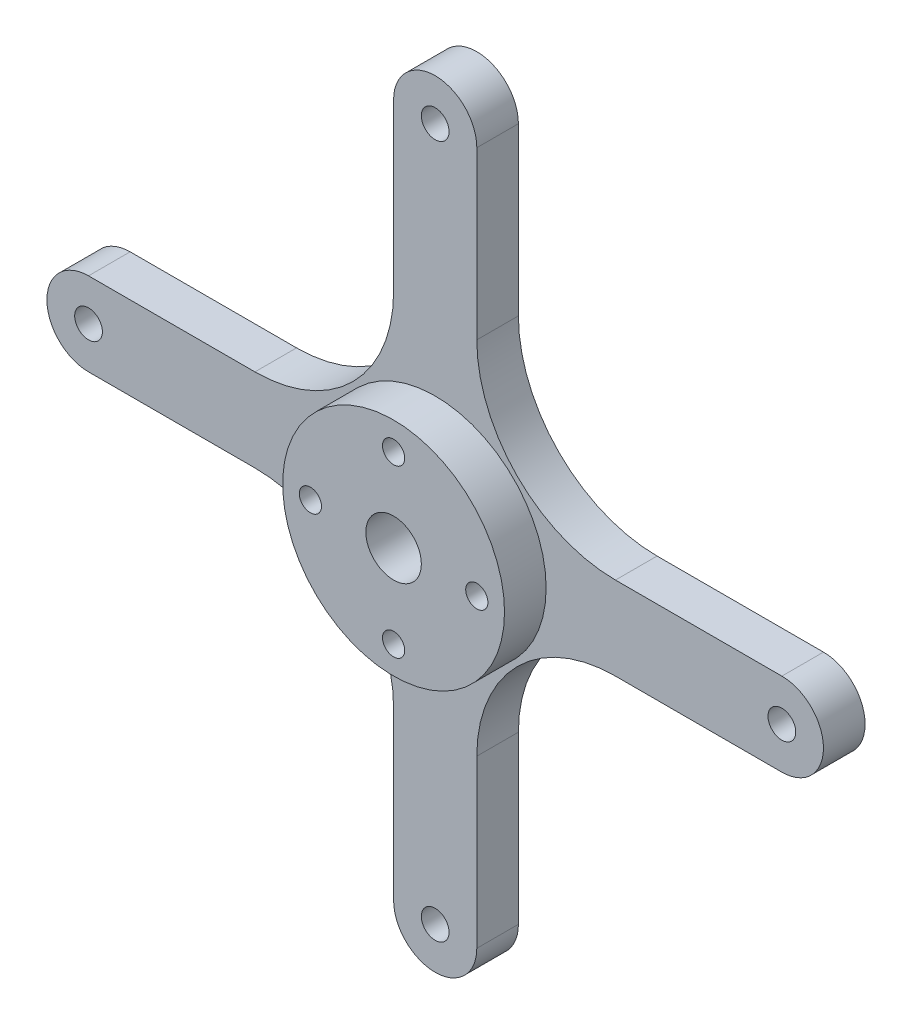
ISO-10303-21;
HEADER;
FILE_DESCRIPTION(('STEP AP214'),'2;1');
FILE_NAME('part.step','',(''),(''),'','','');
FILE_SCHEMA(('AUTOMOTIVE_DESIGN { 1 0 10303 214 1 1 1 1 }'));
ENDSEC;
DATA;
#1=APPLICATION_CONTEXT('core data for automotive mechanical design processes');
#2=APPLICATION_PROTOCOL_DEFINITION('international standard','automotive_design',2000,#1);
#3=PRODUCT_CONTEXT('',#1,'mechanical');
#4=PRODUCT('Part','Part','',(#3));
#5=PRODUCT_RELATED_PRODUCT_CATEGORY('part','',(#4));
#6=PRODUCT_DEFINITION_FORMATION('','',#4);
#7=PRODUCT_DEFINITION_CONTEXT('part definition',#1,'design');
#8=PRODUCT_DEFINITION('design','',#6,#7);
#9=PRODUCT_DEFINITION_SHAPE('','',#8);
#10=(LENGTH_UNIT() NAMED_UNIT(*) SI_UNIT(.MILLI.,.METRE.));
#11=(NAMED_UNIT(*) PLANE_ANGLE_UNIT() SI_UNIT($,.RADIAN.));
#12=(NAMED_UNIT(*) SI_UNIT($,.STERADIAN.) SOLID_ANGLE_UNIT());
#13=UNCERTAINTY_MEASURE_WITH_UNIT(LENGTH_MEASURE(1.E-05),#10,'distance_accuracy_value','');
#14=(GEOMETRIC_REPRESENTATION_CONTEXT(3) GLOBAL_UNCERTAINTY_ASSIGNED_CONTEXT((#13)) GLOBAL_UNIT_ASSIGNED_CONTEXT((#10,
#11,#12)) REPRESENTATION_CONTEXT('',''));
#15=CARTESIAN_POINT('',(0.,0.,0.));
#16=DIRECTION('',(0.,0.,1.));
#17=DIRECTION('',(1.,0.,0.));
#18=AXIS2_PLACEMENT_3D('',#15,#16,#17);
#19=CARTESIAN_POINT('',(0.,3.,3.));
#20=DIRECTION('',(0.,-1.,0.));
#21=DIRECTION('',(1.,0.,0.));
#22=AXIS2_PLACEMENT_3D('',#19,#20,#21);
#23=PLANE('',#22);
#24=DIRECTION('',(-1.,0.,0.));
#25=VECTOR('',#24,1.);
#26=CARTESIAN_POINT('',(0.,3.,0.));
#27=LINE('',#26,#25);
#28=CARTESIAN_POINT('',(25.,3.00000000000001,0.));
#29=VERTEX_POINT('',#28);
#30=CARTESIAN_POINT('',(13.,3.00000000000001,0.));
#31=VERTEX_POINT('',#30);
#32=EDGE_CURVE('E226',#29,#31,#27,.T.);
#33=ORIENTED_EDGE('',*,*,#32,.T.);
#34=DIRECTION('',(0.,0.,-1.));
#35=VECTOR('',#34,1.);
#36=CARTESIAN_POINT('',(13.,3.00000000000001,3.));
#37=LINE('',#36,#35);
#38=CARTESIAN_POINT('',(13.,3.00000000000001,3.));
#39=VERTEX_POINT('',#38);
#40=EDGE_CURVE('E63',#31,#39,#37,.F.);
#41=ORIENTED_EDGE('',*,*,#40,.T.);
#42=DIRECTION('',(-1.,0.,0.));
#43=VECTOR('',#42,1.);
#44=CARTESIAN_POINT('',(0.,3.,3.));
#45=LINE('',#44,#43);
#46=CARTESIAN_POINT('',(25.,3.00000000000001,3.));
#47=VERTEX_POINT('',#46);
#48=EDGE_CURVE('E175',#47,#39,#45,.T.);
#49=ORIENTED_EDGE('',*,*,#48,.F.);
#50=DIRECTION('',(0.,0.,-1.));
#51=VECTOR('',#50,1.);
#52=CARTESIAN_POINT('',(25.,3.00000000000001,3.));
#53=LINE('',#52,#51);
#54=EDGE_CURVE('E225',#47,#29,#53,.T.);
#55=ORIENTED_EDGE('',*,*,#54,.T.);
#56=EDGE_LOOP('',(#33,#41,#49,#55));
#57=FACE_BOUND('',#56,.T.);
#58=ADVANCED_FACE('F46',(#57),#23,.F.);
#59=CARTESIAN_POINT('',(2.99999999999999,0.,3.));
#60=DIRECTION('',(-1.,0.,0.));
#61=DIRECTION('',(0.,-1.,0.));
#62=AXIS2_PLACEMENT_3D('',#59,#60,#61);
#63=PLANE('',#62);
#64=DIRECTION('',(0.,1.,0.));
#65=VECTOR('',#64,1.);
#66=CARTESIAN_POINT('',(2.99999999999999,0.,3.));
#67=LINE('',#66,#65);
#68=CARTESIAN_POINT('',(2.99999999999999,13.,3.));
#69=VERTEX_POINT('',#68);
#70=CARTESIAN_POINT('',(2.99999999999999,25.,3.));
#71=VERTEX_POINT('',#70);
#72=EDGE_CURVE('E163',#69,#71,#67,.T.);
#73=ORIENTED_EDGE('',*,*,#72,.F.);
#74=DIRECTION('',(0.,0.,-1.));
#75=VECTOR('',#74,1.);
#76=CARTESIAN_POINT('',(2.99999999999999,13.,0.));
#77=LINE('',#76,#75);
#78=CARTESIAN_POINT('',(2.99999999999999,13.,0.));
#79=VERTEX_POINT('',#78);
#80=EDGE_CURVE('E325',#69,#79,#77,.T.);
#81=ORIENTED_EDGE('',*,*,#80,.T.);
#82=DIRECTION('',(0.,1.,0.));
#83=VECTOR('',#82,1.);
#84=CARTESIAN_POINT('',(2.99999999999999,0.,0.));
#85=LINE('',#84,#83);
#86=CARTESIAN_POINT('',(2.99999999999999,25.,0.));
#87=VERTEX_POINT('',#86);
#88=EDGE_CURVE('E180',#79,#87,#85,.T.);
#89=ORIENTED_EDGE('',*,*,#88,.T.);
#90=DIRECTION('',(0.,0.,-1.));
#91=VECTOR('',#90,1.);
#92=CARTESIAN_POINT('',(2.99999999999999,25.,3.));
#93=LINE('',#92,#91);
#94=EDGE_CURVE('E178',#71,#87,#93,.T.);
#95=ORIENTED_EDGE('',*,*,#94,.F.);
#96=EDGE_LOOP('',(#73,#81,#89,#95));
#97=FACE_BOUND('',#96,.T.);
#98=ADVANCED_FACE('F179',(#97),#63,.F.);
#99=CARTESIAN_POINT('',(0.,25.,3.));
#100=DIRECTION('',(0.,0.,-1.));
#101=DIRECTION('',(-1.,0.,0.));
#102=AXIS2_PLACEMENT_3D('',#99,#100,#101);
#103=CYLINDRICAL_SURFACE('',#102,3.);
#104=CARTESIAN_POINT('',(0.,25.,0.));
#105=DIRECTION('',(0.,0.,1.));
#106=DIRECTION('',(1.,0.,0.));
#107=AXIS2_PLACEMENT_3D('',#104,#105,#106);
#108=CIRCLE('',#107,3.);
#109=CARTESIAN_POINT('',(-3.00000000000001,25.,0.));
#110=VERTEX_POINT('',#109);
#111=EDGE_CURVE('E232',#87,#110,#108,.T.);
#112=ORIENTED_EDGE('',*,*,#111,.T.);
#113=DIRECTION('',(0.,0.,-1.));
#114=VECTOR('',#113,1.);
#115=CARTESIAN_POINT('',(-3.00000000000001,25.,3.));
#116=LINE('',#115,#114);
#117=CARTESIAN_POINT('',(-3.00000000000001,25.,3.));
#118=VERTEX_POINT('',#117);
#119=EDGE_CURVE('E186',#118,#110,#116,.T.);
#120=ORIENTED_EDGE('',*,*,#119,.F.);
#121=CARTESIAN_POINT('',(0.,25.,3.));
#122=DIRECTION('',(0.,0.,1.));
#123=DIRECTION('',(1.,0.,0.));
#124=AXIS2_PLACEMENT_3D('',#121,#122,#123);
#125=CIRCLE('',#124,3.);
#126=EDGE_CURVE('E168',#71,#118,#125,.T.);
#127=ORIENTED_EDGE('',*,*,#126,.F.);
#128=ORIENTED_EDGE('',*,*,#94,.T.);
#129=EDGE_LOOP('',(#112,#120,#127,#128));
#130=FACE_BOUND('',#129,.T.);
#131=ADVANCED_FACE('F188',(#130),#103,.T.);
#132=CARTESIAN_POINT('',(-3.00000000000001,0.,3.));
#133=DIRECTION('',(-1.,0.,0.));
#134=DIRECTION('',(0.,-1.,0.));
#135=AXIS2_PLACEMENT_3D('',#132,#133,#134);
#136=PLANE('',#135);
#137=DIRECTION('',(0.,1.,0.));
#138=VECTOR('',#137,1.);
#139=CARTESIAN_POINT('',(-3.00000000000001,0.,0.));
#140=LINE('',#139,#138);
#141=CARTESIAN_POINT('',(-3.00000000000001,13.,0.));
#142=VERTEX_POINT('',#141);
#143=EDGE_CURVE('E235',#142,#110,#140,.T.);
#144=ORIENTED_EDGE('',*,*,#143,.F.);
#145=DIRECTION('',(0.,0.,-1.));
#146=VECTOR('',#145,1.);
#147=CARTESIAN_POINT('',(-3.00000000000001,13.,3.));
#148=LINE('',#147,#146);
#149=CARTESIAN_POINT('',(-3.00000000000001,13.,3.));
#150=VERTEX_POINT('',#149);
#151=EDGE_CURVE('E308',#142,#150,#148,.F.);
#152=ORIENTED_EDGE('',*,*,#151,.T.);
#153=DIRECTION('',(0.,1.,0.));
#154=VECTOR('',#153,1.);
#155=CARTESIAN_POINT('',(-3.00000000000001,0.,3.));
#156=LINE('',#155,#154);
#157=EDGE_CURVE('E191',#150,#118,#156,.T.);
#158=ORIENTED_EDGE('',*,*,#157,.T.);
#159=ORIENTED_EDGE('',*,*,#119,.T.);
#160=EDGE_LOOP('',(#144,#152,#158,#159));
#161=FACE_BOUND('',#160,.T.);
#162=ADVANCED_FACE('F401',(#161),#136,.T.);
#163=CARTESIAN_POINT('',(0.,3.,3.));
#164=DIRECTION('',(0.,-1.,0.));
#165=DIRECTION('',(1.,0.,0.));
#166=AXIS2_PLACEMENT_3D('',#163,#164,#165);
#167=PLANE('',#166);
#168=DIRECTION('',(-1.,0.,0.));
#169=VECTOR('',#168,1.);
#170=CARTESIAN_POINT('',(0.,3.,3.));
#171=LINE('',#170,#169);
#172=CARTESIAN_POINT('',(-13.,3.,3.));
#173=VERTEX_POINT('',#172);
#174=CARTESIAN_POINT('',(-25.,3.,3.));
#175=VERTEX_POINT('',#174);
#176=EDGE_CURVE('E194',#173,#175,#171,.T.);
#177=ORIENTED_EDGE('',*,*,#176,.F.);
#178=DIRECTION('',(0.,0.,-1.));
#179=VECTOR('',#178,1.);
#180=CARTESIAN_POINT('',(-13.,3.,3.));
#181=LINE('',#180,#179);
#182=CARTESIAN_POINT('',(-13.,3.,0.));
#183=VERTEX_POINT('',#182);
#184=EDGE_CURVE('E185',#173,#183,#181,.T.);
#185=ORIENTED_EDGE('',*,*,#184,.T.);
#186=DIRECTION('',(-1.,0.,0.));
#187=VECTOR('',#186,1.);
#188=CARTESIAN_POINT('',(0.,3.,0.));
#189=LINE('',#188,#187);
#190=CARTESIAN_POINT('',(-25.,3.,0.));
#191=VERTEX_POINT('',#190);
#192=EDGE_CURVE('E238',#183,#191,#189,.T.);
#193=ORIENTED_EDGE('',*,*,#192,.T.);
#194=DIRECTION('',(0.,0.,-1.));
#195=VECTOR('',#194,1.);
#196=CARTESIAN_POINT('',(-25.,3.,3.));
#197=LINE('',#196,#195);
#198=EDGE_CURVE('E299',#175,#191,#197,.T.);
#199=ORIENTED_EDGE('',*,*,#198,.F.);
#200=EDGE_LOOP('',(#177,#185,#193,#199));
#201=FACE_BOUND('',#200,.T.);
#202=ADVANCED_FACE('F394',(#201),#167,.F.);
#203=CARTESIAN_POINT('',(-25.,0.,3.));
#204=DIRECTION('',(0.,0.,-1.));
#205=DIRECTION('',(-1.,0.,0.));
#206=AXIS2_PLACEMENT_3D('',#203,#204,#205);
#207=CYLINDRICAL_SURFACE('',#206,3.);
#208=CARTESIAN_POINT('',(-25.,0.,0.));
#209=DIRECTION('',(0.,0.,1.));
#210=DIRECTION('',(1.,0.,0.));
#211=AXIS2_PLACEMENT_3D('',#208,#209,#210);
#212=CIRCLE('',#211,3.);
#213=CARTESIAN_POINT('',(-25.,-3.,0.));
#214=VERTEX_POINT('',#213);
#215=EDGE_CURVE('E241',#191,#214,#212,.T.);
#216=ORIENTED_EDGE('',*,*,#215,.T.);
#217=DIRECTION('',(0.,0.,-1.));
#218=VECTOR('',#217,1.);
#219=CARTESIAN_POINT('',(-25.,-3.,3.));
#220=LINE('',#219,#218);
#221=CARTESIAN_POINT('',(-25.,-3.,3.));
#222=VERTEX_POINT('',#221);
#223=EDGE_CURVE('E295',#222,#214,#220,.T.);
#224=ORIENTED_EDGE('',*,*,#223,.F.);
#225=CARTESIAN_POINT('',(-25.,0.,3.));
#226=DIRECTION('',(0.,0.,1.));
#227=DIRECTION('',(1.,0.,0.));
#228=AXIS2_PLACEMENT_3D('',#225,#226,#227);
#229=CIRCLE('',#228,3.);
#230=EDGE_CURVE('E200',#175,#222,#229,.T.);
#231=ORIENTED_EDGE('',*,*,#230,.F.);
#232=ORIENTED_EDGE('',*,*,#198,.T.);
#233=EDGE_LOOP('',(#216,#224,#231,#232));
#234=FACE_BOUND('',#233,.T.);
#235=ADVANCED_FACE('F388',(#234),#207,.T.);
#236=CARTESIAN_POINT('',(0.,-3.,3.));
#237=DIRECTION('',(0.,-1.,0.));
#238=DIRECTION('',(1.,0.,0.));
#239=AXIS2_PLACEMENT_3D('',#236,#237,#238);
#240=PLANE('',#239);
#241=DIRECTION('',(-1.,0.,0.));
#242=VECTOR('',#241,1.);
#243=CARTESIAN_POINT('',(0.,-3.,0.));
#244=LINE('',#243,#242);
#245=CARTESIAN_POINT('',(-13.,-3.,0.));
#246=VERTEX_POINT('',#245);
#247=EDGE_CURVE('E245',#246,#214,#244,.T.);
#248=ORIENTED_EDGE('',*,*,#247,.F.);
#249=DIRECTION('',(0.,0.,-1.));
#250=VECTOR('',#249,1.);
#251=CARTESIAN_POINT('',(-13.,-3.,3.));
#252=LINE('',#251,#250);
#253=CARTESIAN_POINT('',(-13.,-3.,3.));
#254=VERTEX_POINT('',#253);
#255=EDGE_CURVE('E315',#246,#254,#252,.F.);
#256=ORIENTED_EDGE('',*,*,#255,.T.);
#257=DIRECTION('',(-1.,0.,0.));
#258=VECTOR('',#257,1.);
#259=CARTESIAN_POINT('',(0.,-3.,3.));
#260=LINE('',#259,#258);
#261=EDGE_CURVE('E204',#254,#222,#260,.T.);
#262=ORIENTED_EDGE('',*,*,#261,.T.);
#263=ORIENTED_EDGE('',*,*,#223,.T.);
#264=EDGE_LOOP('',(#248,#256,#262,#263));
#265=FACE_BOUND('',#264,.T.);
#266=ADVANCED_FACE('F383',(#265),#240,.T.);
#267=CARTESIAN_POINT('',(-3.00000000000001,0.,3.));
#268=DIRECTION('',(-1.,0.,0.));
#269=DIRECTION('',(0.,-1.,0.));
#270=AXIS2_PLACEMENT_3D('',#267,#268,#269);
#271=PLANE('',#270);
#272=DIRECTION('',(0.,1.,0.));
#273=VECTOR('',#272,1.);
#274=CARTESIAN_POINT('',(-3.00000000000001,0.,3.));
#275=LINE('',#274,#273);
#276=CARTESIAN_POINT('',(-3.00000000000001,-25.,3.));
#277=VERTEX_POINT('',#276);
#278=CARTESIAN_POINT('',(-3.00000000000001,-13.,3.));
#279=VERTEX_POINT('',#278);
#280=EDGE_CURVE('E207',#277,#279,#275,.T.);
#281=ORIENTED_EDGE('',*,*,#280,.T.);
#282=DIRECTION('',(0.,0.,-1.));
#283=VECTOR('',#282,1.);
#284=CARTESIAN_POINT('',(-3.00000000000001,-13.,0.));
#285=LINE('',#284,#283);
#286=CARTESIAN_POINT('',(-3.00000000000001,-13.,0.));
#287=VERTEX_POINT('',#286);
#288=EDGE_CURVE('E311',#279,#287,#285,.T.);
#289=ORIENTED_EDGE('',*,*,#288,.T.);
#290=DIRECTION('',(0.,1.,0.));
#291=VECTOR('',#290,1.);
#292=CARTESIAN_POINT('',(-3.00000000000001,0.,0.));
#293=LINE('',#292,#291);
#294=CARTESIAN_POINT('',(-3.00000000000001,-25.,0.));
#295=VERTEX_POINT('',#294);
#296=EDGE_CURVE('E248',#295,#287,#293,.T.);
#297=ORIENTED_EDGE('',*,*,#296,.F.);
#298=DIRECTION('',(0.,0.,-1.));
#299=VECTOR('',#298,1.);
#300=CARTESIAN_POINT('',(-3.00000000000001,-25.,3.));
#301=LINE('',#300,#299);
#302=EDGE_CURVE('E292',#277,#295,#301,.T.);
#303=ORIENTED_EDGE('',*,*,#302,.F.);
#304=EDGE_LOOP('',(#281,#289,#297,#303));
#305=FACE_BOUND('',#304,.T.);
#306=ADVANCED_FACE('F374',(#305),#271,.T.);
#307=CARTESIAN_POINT('',(0.,-25.,3.));
#308=DIRECTION('',(0.,0.,-1.));
#309=DIRECTION('',(-1.,0.,0.));
#310=AXIS2_PLACEMENT_3D('',#307,#308,#309);
#311=CYLINDRICAL_SURFACE('',#310,3.);
#312=CARTESIAN_POINT('',(0.,-25.,0.));
#313=DIRECTION('',(0.,0.,1.));
#314=DIRECTION('',(1.,0.,0.));
#315=AXIS2_PLACEMENT_3D('',#312,#313,#314);
#316=CIRCLE('',#315,3.);
#317=CARTESIAN_POINT('',(2.99999999999999,-25.,0.));
#318=VERTEX_POINT('',#317);
#319=EDGE_CURVE('E252',#295,#318,#316,.T.);
#320=ORIENTED_EDGE('',*,*,#319,.T.);
#321=DIRECTION('',(0.,0.,-1.));
#322=VECTOR('',#321,1.);
#323=CARTESIAN_POINT('',(2.99999999999999,-25.,3.));
#324=LINE('',#323,#322);
#325=CARTESIAN_POINT('',(2.99999999999999,-25.,3.));
#326=VERTEX_POINT('',#325);
#327=EDGE_CURVE('E288',#326,#318,#324,.T.);
#328=ORIENTED_EDGE('',*,*,#327,.F.);
#329=CARTESIAN_POINT('',(0.,-25.,3.));
#330=DIRECTION('',(0.,0.,1.));
#331=DIRECTION('',(1.,0.,0.));
#332=AXIS2_PLACEMENT_3D('',#329,#330,#331);
#333=CIRCLE('',#332,3.);
#334=EDGE_CURVE('E211',#277,#326,#333,.T.);
#335=ORIENTED_EDGE('',*,*,#334,.F.);
#336=ORIENTED_EDGE('',*,*,#302,.T.);
#337=EDGE_LOOP('',(#320,#328,#335,#336));
#338=FACE_BOUND('',#337,.T.);
#339=ADVANCED_FACE('F370',(#338),#311,.T.);
#340=CARTESIAN_POINT('',(2.99999999999999,0.,3.));
#341=DIRECTION('',(-1.,0.,0.));
#342=DIRECTION('',(0.,-1.,0.));
#343=AXIS2_PLACEMENT_3D('',#340,#341,#342);
#344=PLANE('',#343);
#345=DIRECTION('',(0.,1.,0.));
#346=VECTOR('',#345,1.);
#347=CARTESIAN_POINT('',(2.99999999999999,0.,0.));
#348=LINE('',#347,#346);
#349=CARTESIAN_POINT('',(2.99999999999999,-13.,0.));
#350=VERTEX_POINT('',#349);
#351=EDGE_CURVE('E255',#318,#350,#348,.T.);
#352=ORIENTED_EDGE('',*,*,#351,.T.);
#353=DIRECTION('',(0.,0.,-1.));
#354=VECTOR('',#353,1.);
#355=CARTESIAN_POINT('',(2.99999999999999,-13.,3.));
#356=LINE('',#355,#354);
#357=CARTESIAN_POINT('',(2.99999999999999,-13.,3.));
#358=VERTEX_POINT('',#357);
#359=EDGE_CURVE('E322',#350,#358,#356,.F.);
#360=ORIENTED_EDGE('',*,*,#359,.T.);
#361=DIRECTION('',(0.,1.,0.));
#362=VECTOR('',#361,1.);
#363=CARTESIAN_POINT('',(2.99999999999999,0.,3.));
#364=LINE('',#363,#362);
#365=EDGE_CURVE('E214',#326,#358,#364,.T.);
#366=ORIENTED_EDGE('',*,*,#365,.F.);
#367=ORIENTED_EDGE('',*,*,#327,.T.);
#368=EDGE_LOOP('',(#352,#360,#366,#367));
#369=FACE_BOUND('',#368,.T.);
#370=ADVANCED_FACE('F366',(#369),#344,.F.);
#371=CARTESIAN_POINT('',(0.,-3.,3.));
#372=DIRECTION('',(0.,-1.,0.));
#373=DIRECTION('',(1.,0.,0.));
#374=AXIS2_PLACEMENT_3D('',#371,#372,#373);
#375=PLANE('',#374);
#376=DIRECTION('',(-1.,0.,0.));
#377=VECTOR('',#376,1.);
#378=CARTESIAN_POINT('',(0.,-3.,3.));
#379=LINE('',#378,#377);
#380=CARTESIAN_POINT('',(25.,-2.99999999999999,3.));
#381=VERTEX_POINT('',#380);
#382=CARTESIAN_POINT('',(13.,-2.99999999999999,3.));
#383=VERTEX_POINT('',#382);
#384=EDGE_CURVE('E218',#381,#383,#379,.T.);
#385=ORIENTED_EDGE('',*,*,#384,.T.);
#386=DIRECTION('',(0.,0.,-1.));
#387=VECTOR('',#386,1.);
#388=CARTESIAN_POINT('',(13.,-2.99999999999999,3.));
#389=LINE('',#388,#387);
#390=CARTESIAN_POINT('',(13.,-2.99999999999999,0.));
#391=VERTEX_POINT('',#390);
#392=EDGE_CURVE('E318',#383,#391,#389,.T.);
#393=ORIENTED_EDGE('',*,*,#392,.T.);
#394=DIRECTION('',(-1.,0.,0.));
#395=VECTOR('',#394,1.);
#396=CARTESIAN_POINT('',(0.,-3.,0.));
#397=LINE('',#396,#395);
#398=CARTESIAN_POINT('',(25.,-2.99999999999999,0.));
#399=VERTEX_POINT('',#398);
#400=EDGE_CURVE('E259',#399,#391,#397,.T.);
#401=ORIENTED_EDGE('',*,*,#400,.F.);
#402=DIRECTION('',(0.,0.,-1.));
#403=VECTOR('',#402,1.);
#404=CARTESIAN_POINT('',(25.,-2.99999999999999,3.));
#405=LINE('',#404,#403);
#406=EDGE_CURVE('E285',#381,#399,#405,.T.);
#407=ORIENTED_EDGE('',*,*,#406,.F.);
#408=EDGE_LOOP('',(#385,#393,#401,#407));
#409=FACE_BOUND('',#408,.T.);
#410=ADVANCED_FACE('F356',(#409),#375,.T.);
#411=CARTESIAN_POINT('',(0.,6.,3.));
#412=DIRECTION('',(0.,0.,-1.));
#413=DIRECTION('',(-1.,0.,0.));
#414=AXIS2_PLACEMENT_3D('',#411,#412,#413);
#415=CYLINDRICAL_SURFACE('',#414,0.8);
#416=CARTESIAN_POINT('',(0.,6.,0.));
#417=DIRECTION('',(0.,0.,1.));
#418=DIRECTION('',(1.,0.,0.));
#419=AXIS2_PLACEMENT_3D('',#416,#417,#418);
#420=CIRCLE('',#419,0.8);
#421=CARTESIAN_POINT('',(0.799999999999999,6.,0.));
#422=VERTEX_POINT('',#421);
#423=EDGE_CURVE('E274',#422,#422,#420,.T.);
#424=ORIENTED_EDGE('',*,*,#423,.F.);
#425=EDGE_LOOP('',(#424));
#426=FACE_BOUND('',#425,.T.);
#427=CARTESIAN_POINT('',(0.,6.,6.));
#428=DIRECTION('',(0.,0.,1.));
#429=DIRECTION('',(1.,0.,0.));
#430=AXIS2_PLACEMENT_3D('',#427,#428,#429);
#431=CIRCLE('',#430,0.800000000000001);
#432=CARTESIAN_POINT('',(0.799999999999999,6.,6.));
#433=VERTEX_POINT('',#432);
#434=EDGE_CURVE('E742',#433,#433,#431,.T.);
#435=ORIENTED_EDGE('',*,*,#434,.T.);
#436=EDGE_LOOP('',(#435));
#437=FACE_BOUND('',#436,.T.);
#438=ADVANCED_FACE('F455',(#426,#437),#415,.F.);
#439=CARTESIAN_POINT('',(0.,-6.,3.));
#440=DIRECTION('',(0.,0.,-1.));
#441=DIRECTION('',(-1.,0.,0.));
#442=AXIS2_PLACEMENT_3D('',#439,#440,#441);
#443=CYLINDRICAL_SURFACE('',#442,0.8);
#444=CARTESIAN_POINT('',(0.,-6.,0.));
#445=DIRECTION('',(0.,0.,1.));
#446=DIRECTION('',(1.,0.,0.));
#447=AXIS2_PLACEMENT_3D('',#444,#445,#446);
#448=CIRCLE('',#447,0.8);
#449=CARTESIAN_POINT('',(0.800000000000002,-6.,0.));
#450=VERTEX_POINT('',#449);
#451=EDGE_CURVE('E270',#450,#450,#448,.T.);
#452=ORIENTED_EDGE('',*,*,#451,.F.);
#453=EDGE_LOOP('',(#452));
#454=FACE_BOUND('',#453,.T.);
#455=CARTESIAN_POINT('',(0.,-6.,6.));
#456=DIRECTION('',(0.,0.,1.));
#457=DIRECTION('',(1.,0.,0.));
#458=AXIS2_PLACEMENT_3D('',#455,#456,#457);
#459=CIRCLE('',#458,0.8);
#460=CARTESIAN_POINT('',(0.800000000000002,-6.,6.));
#461=VERTEX_POINT('',#460);
#462=EDGE_CURVE('E734',#461,#461,#459,.T.);
#463=ORIENTED_EDGE('',*,*,#462,.T.);
#464=EDGE_LOOP('',(#463));
#465=FACE_BOUND('',#464,.T.);
#466=ADVANCED_FACE('F457',(#454,#465),#443,.F.);
#467=CARTESIAN_POINT('',(-6.,0.,3.));
#468=DIRECTION('',(0.,0.,-1.));
#469=DIRECTION('',(-1.,0.,0.));
#470=AXIS2_PLACEMENT_3D('',#467,#468,#469);
#471=CYLINDRICAL_SURFACE('',#470,0.800000000000001);
#472=CARTESIAN_POINT('',(-6.,0.,0.));
#473=DIRECTION('',(0.,0.,1.));
#474=DIRECTION('',(1.,0.,0.));
#475=AXIS2_PLACEMENT_3D('',#472,#473,#474);
#476=CIRCLE('',#475,0.800000000000001);
#477=CARTESIAN_POINT('',(-5.2,0.,0.));
#478=VERTEX_POINT('',#477);
#479=EDGE_CURVE('E266',#478,#478,#476,.T.);
#480=ORIENTED_EDGE('',*,*,#479,.F.);
#481=EDGE_LOOP('',(#480));
#482=FACE_BOUND('',#481,.T.);
#483=CARTESIAN_POINT('',(-6.,0.,6.));
#484=DIRECTION('',(0.,0.,1.));
#485=DIRECTION('',(1.,0.,0.));
#486=AXIS2_PLACEMENT_3D('',#483,#484,#485);
#487=CIRCLE('',#486,0.800000000000001);
#488=CARTESIAN_POINT('',(-5.2,0.,6.));
#489=VERTEX_POINT('',#488);
#490=EDGE_CURVE('E706',#489,#489,#487,.T.);
#491=ORIENTED_EDGE('',*,*,#490,.T.);
#492=EDGE_LOOP('',(#491));
#493=FACE_BOUND('',#492,.T.);
#494=ADVANCED_FACE('F461',(#482,#493),#471,.F.);
#495=CARTESIAN_POINT('',(25.,0.,3.));
#496=DIRECTION('',(0.,0.,-1.));
#497=DIRECTION('',(-1.,0.,0.));
#498=AXIS2_PLACEMENT_3D('',#495,#496,#497);
#499=CYLINDRICAL_SURFACE('',#498,3.);
#500=CARTESIAN_POINT('',(25.,0.,0.));
#501=DIRECTION('',(0.,0.,1.));
#502=DIRECTION('',(1.,0.,0.));
#503=AXIS2_PLACEMENT_3D('',#500,#501,#502);
#504=CIRCLE('',#503,3.);
#505=EDGE_CURVE('E263',#399,#29,#504,.T.);
#506=ORIENTED_EDGE('',*,*,#505,.T.);
#507=ORIENTED_EDGE('',*,*,#54,.F.);
#508=CARTESIAN_POINT('',(25.,0.,3.));
#509=DIRECTION('',(0.,0.,1.));
#510=DIRECTION('',(1.,0.,0.));
#511=AXIS2_PLACEMENT_3D('',#508,#509,#510);
#512=CIRCLE('',#511,3.);
#513=EDGE_CURVE('E222',#381,#47,#512,.T.);
#514=ORIENTED_EDGE('',*,*,#513,.F.);
#515=ORIENTED_EDGE('',*,*,#406,.T.);
#516=EDGE_LOOP('',(#506,#507,#514,#515));
#517=FACE_BOUND('',#516,.T.);
#518=ADVANCED_FACE('F453',(#517),#499,.T.);
#519=CARTESIAN_POINT('',(6.,0.,3.));
#520=DIRECTION('',(0.,0.,-1.));
#521=DIRECTION('',(-1.,0.,0.));
#522=AXIS2_PLACEMENT_3D('',#519,#520,#521);
#523=CYLINDRICAL_SURFACE('',#522,0.800000000000001);
#524=CARTESIAN_POINT('',(6.,0.,0.));
#525=DIRECTION('',(0.,0.,1.));
#526=DIRECTION('',(1.,0.,0.));
#527=AXIS2_PLACEMENT_3D('',#524,#525,#526);
#528=CIRCLE('',#527,0.800000000000001);
#529=CARTESIAN_POINT('',(6.8,0.,0.));
#530=VERTEX_POINT('',#529);
#531=EDGE_CURVE('E278',#530,#530,#528,.T.);
#532=ORIENTED_EDGE('',*,*,#531,.F.);
#533=EDGE_LOOP('',(#532));
#534=FACE_BOUND('',#533,.T.);
#535=CARTESIAN_POINT('',(6.,0.,6.));
#536=DIRECTION('',(0.,0.,1.));
#537=DIRECTION('',(1.,0.,0.));
#538=AXIS2_PLACEMENT_3D('',#535,#536,#537);
#539=CIRCLE('',#538,0.800000000000001);
#540=CARTESIAN_POINT('',(6.8,0.,6.));
#541=VERTEX_POINT('',#540);
#542=EDGE_CURVE('E738',#541,#541,#539,.T.);
#543=ORIENTED_EDGE('',*,*,#542,.T.);
#544=EDGE_LOOP('',(#543));
#545=FACE_BOUND('',#544,.T.);
#546=ADVANCED_FACE('F447',(#534,#545),#523,.F.);
#547=CARTESIAN_POINT('',(0.,0.,3.));
#548=DIRECTION('',(0.,0.,1.));
#549=DIRECTION('',(1.,0.,0.));
#550=AXIS2_PLACEMENT_3D('',#547,#548,#549);
#551=PLANE('',#550);
#552=CARTESIAN_POINT('',(0.,25.,3.));
#553=DIRECTION('',(0.,0.,1.));
#554=DIRECTION('',(1.,0.,0.));
#555=AXIS2_PLACEMENT_3D('',#552,#553,#554);
#556=CIRCLE('',#555,1.);
#557=CARTESIAN_POINT('',(1.,25.,3.));
#558=VERTEX_POINT('',#557);
#559=EDGE_CURVE('E700',#558,#558,#556,.T.);
#560=ORIENTED_EDGE('',*,*,#559,.F.);
#561=EDGE_LOOP('',(#560));
#562=FACE_BOUND('',#561,.T.);
#563=CARTESIAN_POINT('',(25.,0.,3.));
#564=DIRECTION('',(0.,0.,1.));
#565=DIRECTION('',(1.,0.,0.));
#566=AXIS2_PLACEMENT_3D('',#563,#564,#565);
#567=CIRCLE('',#566,0.999999999999998);
#568=CARTESIAN_POINT('',(26.,0.,3.));
#569=VERTEX_POINT('',#568);
#570=EDGE_CURVE('E702',#569,#569,#567,.T.);
#571=ORIENTED_EDGE('',*,*,#570,.F.);
#572=EDGE_LOOP('',(#571));
#573=FACE_BOUND('',#572,.T.);
#574=CARTESIAN_POINT('',(0.,-25.,3.));
#575=DIRECTION('',(0.,0.,1.));
#576=DIRECTION('',(1.,0.,0.));
#577=AXIS2_PLACEMENT_3D('',#574,#575,#576);
#578=CIRCLE('',#577,1.);
#579=CARTESIAN_POINT('',(1.00000000000001,-25.,3.));
#580=VERTEX_POINT('',#579);
#581=EDGE_CURVE('E715',#580,#580,#578,.T.);
#582=ORIENTED_EDGE('',*,*,#581,.F.);
#583=EDGE_LOOP('',(#582));
#584=FACE_BOUND('',#583,.T.);
#585=CARTESIAN_POINT('',(-25.,0.,3.));
#586=DIRECTION('',(0.,0.,1.));
#587=DIRECTION('',(1.,0.,0.));
#588=AXIS2_PLACEMENT_3D('',#585,#586,#587);
#589=CIRCLE('',#588,1.);
#590=CARTESIAN_POINT('',(-24.,0.,3.));
#591=VERTEX_POINT('',#590);
#592=EDGE_CURVE('E723',#591,#591,#589,.T.);
#593=ORIENTED_EDGE('',*,*,#592,.F.);
#594=EDGE_LOOP('',(#593));
#595=FACE_BOUND('',#594,.T.);
#596=CARTESIAN_POINT('',(0.,0.,3.));
#597=DIRECTION('',(0.,0.,1.));
#598=DIRECTION('',(1.,0.,0.));
#599=AXIS2_PLACEMENT_3D('',#596,#597,#598);
#600=CIRCLE('',#599,8.);
#601=CARTESIAN_POINT('',(8.,0.,3.));
#602=VERTEX_POINT('',#601);
#603=EDGE_CURVE('E11',#602,#602,#600,.T.);
#604=ORIENTED_EDGE('',*,*,#603,.F.);
#605=EDGE_LOOP('',(#604));
#606=FACE_BOUND('',#605,.T.);
#607=ORIENTED_EDGE('',*,*,#48,.T.);
#608=CARTESIAN_POINT('',(13.,13.,3.));
#609=DIRECTION('',(0.,0.,1.));
#610=DIRECTION('',(1.,0.,0.));
#611=AXIS2_PLACEMENT_3D('',#608,#609,#610);
#612=CIRCLE('',#611,10.);
#613=EDGE_CURVE('E50',#39,#69,#612,.F.);
#614=ORIENTED_EDGE('',*,*,#613,.T.);
#615=ORIENTED_EDGE('',*,*,#72,.T.);
#616=ORIENTED_EDGE('',*,*,#126,.T.);
#617=ORIENTED_EDGE('',*,*,#157,.F.);
#618=CARTESIAN_POINT('',(-13.,13.,3.));
#619=DIRECTION('',(0.,0.,1.));
#620=DIRECTION('',(1.,0.,0.));
#621=AXIS2_PLACEMENT_3D('',#618,#619,#620);
#622=CIRCLE('',#621,10.);
#623=EDGE_CURVE('E333',#150,#173,#622,.F.);
#624=ORIENTED_EDGE('',*,*,#623,.T.);
#625=ORIENTED_EDGE('',*,*,#176,.T.);
#626=ORIENTED_EDGE('',*,*,#230,.T.);
#627=ORIENTED_EDGE('',*,*,#261,.F.);
#628=CARTESIAN_POINT('',(-13.,-13.,3.));
#629=DIRECTION('',(0.,0.,1.));
#630=DIRECTION('',(1.,0.,0.));
#631=AXIS2_PLACEMENT_3D('',#628,#629,#630);
#632=CIRCLE('',#631,10.);
#633=EDGE_CURVE('E339',#254,#279,#632,.F.);
#634=ORIENTED_EDGE('',*,*,#633,.T.);
#635=ORIENTED_EDGE('',*,*,#280,.F.);
#636=ORIENTED_EDGE('',*,*,#334,.T.);
#637=ORIENTED_EDGE('',*,*,#365,.T.);
#638=CARTESIAN_POINT('',(13.,-13.,3.));
#639=DIRECTION('',(0.,0.,1.));
#640=DIRECTION('',(1.,0.,0.));
#641=AXIS2_PLACEMENT_3D('',#638,#639,#640);
#642=CIRCLE('',#641,10.);
#643=EDGE_CURVE('E345',#358,#383,#642,.F.);
#644=ORIENTED_EDGE('',*,*,#643,.T.);
#645=ORIENTED_EDGE('',*,*,#384,.F.);
#646=ORIENTED_EDGE('',*,*,#513,.T.);
#647=EDGE_LOOP('',(#607,#614,#615,#616,#617,#624,#625,#626,#627,#634,#635,#636,#637,#644,#645,#646));
#648=FACE_BOUND('',#647,.T.);
#649=ADVANCED_FACE('F165',(#562,#573,#584,#595,#606,#648),#551,.T.);
#650=CARTESIAN_POINT('',(0.,0.,0.));
#651=DIRECTION('',(0.,0.,1.));
#652=DIRECTION('',(1.,0.,0.));
#653=AXIS2_PLACEMENT_3D('',#650,#651,#652);
#654=PLANE('',#653);
#655=CARTESIAN_POINT('',(0.,25.,0.));
#656=DIRECTION('',(0.,0.,1.));
#657=DIRECTION('',(1.,0.,0.));
#658=AXIS2_PLACEMENT_3D('',#655,#656,#657);
#659=CIRCLE('',#658,1.);
#660=CARTESIAN_POINT('',(1.,25.,0.));
#661=VERTEX_POINT('',#660);
#662=EDGE_CURVE('E697',#661,#661,#659,.T.);
#663=ORIENTED_EDGE('',*,*,#662,.T.);
#664=EDGE_LOOP('',(#663));
#665=FACE_BOUND('',#664,.T.);
#666=CARTESIAN_POINT('',(25.,0.,0.));
#667=DIRECTION('',(0.,0.,1.));
#668=DIRECTION('',(1.,0.,0.));
#669=AXIS2_PLACEMENT_3D('',#666,#667,#668);
#670=CIRCLE('',#669,0.999999999999998);
#671=CARTESIAN_POINT('',(26.,0.,0.));
#672=VERTEX_POINT('',#671);
#673=EDGE_CURVE('E709',#672,#672,#670,.T.);
#674=ORIENTED_EDGE('',*,*,#673,.T.);
#675=EDGE_LOOP('',(#674));
#676=FACE_BOUND('',#675,.T.);
#677=CARTESIAN_POINT('',(0.,-25.,0.));
#678=DIRECTION('',(0.,0.,1.));
#679=DIRECTION('',(1.,0.,0.));
#680=AXIS2_PLACEMENT_3D('',#677,#678,#679);
#681=CIRCLE('',#680,1.);
#682=CARTESIAN_POINT('',(1.00000000000001,-25.,0.));
#683=VERTEX_POINT('',#682);
#684=EDGE_CURVE('E719',#683,#683,#681,.T.);
#685=ORIENTED_EDGE('',*,*,#684,.T.);
#686=EDGE_LOOP('',(#685));
#687=FACE_BOUND('',#686,.T.);
#688=CARTESIAN_POINT('',(-25.,0.,0.));
#689=DIRECTION('',(0.,0.,1.));
#690=DIRECTION('',(1.,0.,0.));
#691=AXIS2_PLACEMENT_3D('',#688,#689,#690);
#692=CIRCLE('',#691,1.);
#693=CARTESIAN_POINT('',(-24.,0.,0.));
#694=VERTEX_POINT('',#693);
#695=EDGE_CURVE('E727',#694,#694,#692,.T.);
#696=ORIENTED_EDGE('',*,*,#695,.T.);
#697=EDGE_LOOP('',(#696));
#698=FACE_BOUND('',#697,.T.);
#699=CARTESIAN_POINT('',(0.,0.,0.));
#700=DIRECTION('',(0.,0.,1.));
#701=DIRECTION('',(1.,0.,0.));
#702=AXIS2_PLACEMENT_3D('',#699,#700,#701);
#703=CIRCLE('',#702,2.);
#704=CARTESIAN_POINT('',(2.,0.,0.));
#705=VERTEX_POINT('',#704);
#706=EDGE_CURVE('E229',#705,#705,#703,.T.);
#707=ORIENTED_EDGE('',*,*,#706,.T.);
#708=EDGE_LOOP('',(#707));
#709=FACE_BOUND('',#708,.T.);
#710=ORIENTED_EDGE('',*,*,#32,.F.);
#711=ORIENTED_EDGE('',*,*,#505,.F.);
#712=ORIENTED_EDGE('',*,*,#400,.T.);
#713=CARTESIAN_POINT('',(13.,-13.,0.));
#714=DIRECTION('',(0.,0.,1.));
#715=DIRECTION('',(1.,0.,0.));
#716=AXIS2_PLACEMENT_3D('',#713,#714,#715);
#717=CIRCLE('',#716,10.);
#718=EDGE_CURVE('E342',#391,#350,#717,.T.);
#719=ORIENTED_EDGE('',*,*,#718,.T.);
#720=ORIENTED_EDGE('',*,*,#351,.F.);
#721=ORIENTED_EDGE('',*,*,#319,.F.);
#722=ORIENTED_EDGE('',*,*,#296,.T.);
#723=CARTESIAN_POINT('',(-13.,-13.,0.));
#724=DIRECTION('',(0.,0.,1.));
#725=DIRECTION('',(1.,0.,0.));
#726=AXIS2_PLACEMENT_3D('',#723,#724,#725);
#727=CIRCLE('',#726,10.);
#728=EDGE_CURVE('E336',#287,#246,#727,.T.);
#729=ORIENTED_EDGE('',*,*,#728,.T.);
#730=ORIENTED_EDGE('',*,*,#247,.T.);
#731=ORIENTED_EDGE('',*,*,#215,.F.);
#732=ORIENTED_EDGE('',*,*,#192,.F.);
#733=CARTESIAN_POINT('',(-13.,13.,0.));
#734=DIRECTION('',(0.,0.,1.));
#735=DIRECTION('',(1.,0.,0.));
#736=AXIS2_PLACEMENT_3D('',#733,#734,#735);
#737=CIRCLE('',#736,10.);
#738=EDGE_CURVE('E330',#183,#142,#737,.T.);
#739=ORIENTED_EDGE('',*,*,#738,.T.);
#740=ORIENTED_EDGE('',*,*,#143,.T.);
#741=ORIENTED_EDGE('',*,*,#111,.F.);
#742=ORIENTED_EDGE('',*,*,#88,.F.);
#743=CARTESIAN_POINT('',(13.,13.,0.));
#744=DIRECTION('',(0.,0.,1.));
#745=DIRECTION('',(1.,0.,0.));
#746=AXIS2_PLACEMENT_3D('',#743,#744,#745);
#747=CIRCLE('',#746,10.);
#748=EDGE_CURVE('E71',#79,#31,#747,.T.);
#749=ORIENTED_EDGE('',*,*,#748,.T.);
#750=EDGE_LOOP('',(#710,#711,#712,#719,#720,#721,#722,#729,#730,#731,#732,#739,#740,#741,#742,#749));
#751=FACE_BOUND('',#750,.T.);
#752=ORIENTED_EDGE('',*,*,#479,.T.);
#753=EDGE_LOOP('',(#752));
#754=FACE_BOUND('',#753,.T.);
#755=ORIENTED_EDGE('',*,*,#451,.T.);
#756=EDGE_LOOP('',(#755));
#757=FACE_BOUND('',#756,.T.);
#758=ORIENTED_EDGE('',*,*,#423,.T.);
#759=EDGE_LOOP('',(#758));
#760=FACE_BOUND('',#759,.T.);
#761=ORIENTED_EDGE('',*,*,#531,.T.);
#762=EDGE_LOOP('',(#761));
#763=FACE_BOUND('',#762,.T.);
#764=ADVANCED_FACE('F361',(#665,#676,#687,#698,#709,#751,#754,#757,#760,#763),#654,.F.);
#765=CARTESIAN_POINT('',(-13.,13.,3.));
#766=DIRECTION('',(0.,0.,-1.));
#767=DIRECTION('',(-1.,0.,0.));
#768=AXIS2_PLACEMENT_3D('',#765,#766,#767);
#769=CYLINDRICAL_SURFACE('',#768,10.);
#770=ORIENTED_EDGE('',*,*,#623,.F.);
#771=ORIENTED_EDGE('',*,*,#151,.F.);
#772=ORIENTED_EDGE('',*,*,#738,.F.);
#773=ORIENTED_EDGE('',*,*,#184,.F.);
#774=EDGE_LOOP('',(#770,#771,#772,#773));
#775=FACE_BOUND('',#774,.T.);
#776=ADVANCED_FACE('F398',(#775),#769,.F.);
#777=CARTESIAN_POINT('',(-13.,-13.,3.));
#778=DIRECTION('',(0.,0.,1.));
#779=DIRECTION('',(1.,0.,0.));
#780=AXIS2_PLACEMENT_3D('',#777,#778,#779);
#781=CYLINDRICAL_SURFACE('',#780,10.);
#782=ORIENTED_EDGE('',*,*,#633,.F.);
#783=ORIENTED_EDGE('',*,*,#255,.F.);
#784=ORIENTED_EDGE('',*,*,#728,.F.);
#785=ORIENTED_EDGE('',*,*,#288,.F.);
#786=EDGE_LOOP('',(#782,#783,#784,#785));
#787=FACE_BOUND('',#786,.T.);
#788=ADVANCED_FACE('F378',(#787),#781,.F.);
#789=CARTESIAN_POINT('',(13.,-13.,3.));
#790=DIRECTION('',(0.,0.,-1.));
#791=DIRECTION('',(-1.,0.,0.));
#792=AXIS2_PLACEMENT_3D('',#789,#790,#791);
#793=CYLINDRICAL_SURFACE('',#792,10.);
#794=ORIENTED_EDGE('',*,*,#643,.F.);
#795=ORIENTED_EDGE('',*,*,#359,.F.);
#796=ORIENTED_EDGE('',*,*,#718,.F.);
#797=ORIENTED_EDGE('',*,*,#392,.F.);
#798=EDGE_LOOP('',(#794,#795,#796,#797));
#799=FACE_BOUND('',#798,.T.);
#800=ADVANCED_FACE('F359',(#799),#793,.F.);
#801=CARTESIAN_POINT('',(13.,13.,3.));
#802=DIRECTION('',(0.,0.,1.));
#803=DIRECTION('',(1.,0.,0.));
#804=AXIS2_PLACEMENT_3D('',#801,#802,#803);
#805=CYLINDRICAL_SURFACE('',#804,10.);
#806=ORIENTED_EDGE('',*,*,#613,.F.);
#807=ORIENTED_EDGE('',*,*,#40,.F.);
#808=ORIENTED_EDGE('',*,*,#748,.F.);
#809=ORIENTED_EDGE('',*,*,#80,.F.);
#810=EDGE_LOOP('',(#806,#807,#808,#809));
#811=FACE_BOUND('',#810,.T.);
#812=ADVANCED_FACE('F48',(#811),#805,.F.);
#813=CARTESIAN_POINT('',(0.,0.,0.));
#814=DIRECTION('',(0.,0.,1.));
#815=DIRECTION('',(1.,0.,0.));
#816=AXIS2_PLACEMENT_3D('',#813,#814,#815);
#817=CYLINDRICAL_SURFACE('',#816,2.);
#818=ORIENTED_EDGE('',*,*,#706,.F.);
#819=EDGE_LOOP('',(#818));
#820=FACE_BOUND('',#819,.T.);
#821=CARTESIAN_POINT('',(0.,0.,6.));
#822=DIRECTION('',(0.,0.,1.));
#823=DIRECTION('',(1.,0.,0.));
#824=AXIS2_PLACEMENT_3D('',#821,#822,#823);
#825=CIRCLE('',#824,2.);
#826=CARTESIAN_POINT('',(2.,0.,6.));
#827=VERTEX_POINT('',#826);
#828=EDGE_CURVE('E746',#827,#827,#825,.T.);
#829=ORIENTED_EDGE('',*,*,#828,.T.);
#830=EDGE_LOOP('',(#829));
#831=FACE_BOUND('',#830,.T.);
#832=ADVANCED_FACE('F425',(#820,#831),#817,.F.);
#833=CARTESIAN_POINT('',(0.,0.,6.));
#834=DIRECTION('',(0.,0.,1.));
#835=DIRECTION('',(1.,0.,0.));
#836=AXIS2_PLACEMENT_3D('',#833,#834,#835);
#837=PLANE('',#836);
#838=ORIENTED_EDGE('',*,*,#462,.F.);
#839=EDGE_LOOP('',(#838));
#840=FACE_BOUND('',#839,.T.);
#841=ORIENTED_EDGE('',*,*,#434,.F.);
#842=EDGE_LOOP('',(#841));
#843=FACE_BOUND('',#842,.T.);
#844=CARTESIAN_POINT('',(0.,0.,6.));
#845=DIRECTION('',(0.,0.,1.));
#846=DIRECTION('',(1.,0.,0.));
#847=AXIS2_PLACEMENT_3D('',#844,#845,#846);
#848=CIRCLE('',#847,8.);
#849=CARTESIAN_POINT('',(8.,0.,6.));
#850=VERTEX_POINT('',#849);
#851=EDGE_CURVE('E750',#850,#850,#848,.T.);
#852=ORIENTED_EDGE('',*,*,#851,.T.);
#853=EDGE_LOOP('',(#852));
#854=FACE_BOUND('',#853,.T.);
#855=ORIENTED_EDGE('',*,*,#828,.F.);
#856=EDGE_LOOP('',(#855));
#857=FACE_BOUND('',#856,.T.);
#858=ORIENTED_EDGE('',*,*,#542,.F.);
#859=EDGE_LOOP('',(#858));
#860=FACE_BOUND('',#859,.T.);
#861=ORIENTED_EDGE('',*,*,#490,.F.);
#862=EDGE_LOOP('',(#861));
#863=FACE_BOUND('',#862,.T.);
#864=ADVANCED_FACE('F431',(#840,#843,#854,#857,#860,#863),#837,.T.);
#865=CARTESIAN_POINT('',(0.,0.,6.));
#866=DIRECTION('',(0.,0.,-1.));
#867=DIRECTION('',(-1.,0.,0.));
#868=AXIS2_PLACEMENT_3D('',#865,#866,#867);
#869=CYLINDRICAL_SURFACE('',#868,8.);
#870=ORIENTED_EDGE('',*,*,#851,.F.);
#871=EDGE_LOOP('',(#870));
#872=FACE_BOUND('',#871,.T.);
#873=ORIENTED_EDGE('',*,*,#603,.T.);
#874=EDGE_LOOP('',(#873));
#875=FACE_BOUND('',#874,.T.);
#876=ADVANCED_FACE('F438',(#872,#875),#869,.T.);
#877=CARTESIAN_POINT('',(-25.,0.,0.));
#878=DIRECTION('',(0.,0.,1.));
#879=DIRECTION('',(1.,0.,0.));
#880=AXIS2_PLACEMENT_3D('',#877,#878,#879);
#881=CYLINDRICAL_SURFACE('',#880,1.);
#882=ORIENTED_EDGE('',*,*,#695,.F.);
#883=EDGE_LOOP('',(#882));
#884=FACE_BOUND('',#883,.T.);
#885=ORIENTED_EDGE('',*,*,#592,.T.);
#886=EDGE_LOOP('',(#885));
#887=FACE_BOUND('',#886,.T.);
#888=ADVANCED_FACE('F653',(#884,#887),#881,.F.);
#889=CARTESIAN_POINT('',(0.,-25.,0.));
#890=DIRECTION('',(0.,0.,1.));
#891=DIRECTION('',(1.,0.,0.));
#892=AXIS2_PLACEMENT_3D('',#889,#890,#891);
#893=CYLINDRICAL_SURFACE('',#892,1.);
#894=ORIENTED_EDGE('',*,*,#684,.F.);
#895=EDGE_LOOP('',(#894));
#896=FACE_BOUND('',#895,.T.);
#897=ORIENTED_EDGE('',*,*,#581,.T.);
#898=EDGE_LOOP('',(#897));
#899=FACE_BOUND('',#898,.T.);
#900=ADVANCED_FACE('F661',(#896,#899),#893,.F.);
#901=CARTESIAN_POINT('',(25.,0.,0.));
#902=DIRECTION('',(0.,0.,1.));
#903=DIRECTION('',(1.,0.,0.));
#904=AXIS2_PLACEMENT_3D('',#901,#902,#903);
#905=CYLINDRICAL_SURFACE('',#904,0.999999999999998);
#906=ORIENTED_EDGE('',*,*,#673,.F.);
#907=EDGE_LOOP('',(#906));
#908=FACE_BOUND('',#907,.T.);
#909=ORIENTED_EDGE('',*,*,#570,.T.);
#910=EDGE_LOOP('',(#909));
#911=FACE_BOUND('',#910,.T.);
#912=ADVANCED_FACE('F671',(#908,#911),#905,.F.);
#913=CARTESIAN_POINT('',(0.,25.,0.));
#914=DIRECTION('',(0.,0.,1.));
#915=DIRECTION('',(1.,0.,0.));
#916=AXIS2_PLACEMENT_3D('',#913,#914,#915);
#917=CYLINDRICAL_SURFACE('',#916,1.);
#918=ORIENTED_EDGE('',*,*,#662,.F.);
#919=EDGE_LOOP('',(#918));
#920=FACE_BOUND('',#919,.T.);
#921=ORIENTED_EDGE('',*,*,#559,.T.);
#922=EDGE_LOOP('',(#921));
#923=FACE_BOUND('',#922,.T.);
#924=ADVANCED_FACE('F681',(#920,#923),#917,.F.);
#925=CLOSED_SHELL('',(#58,#98,#131,#162,#202,#235,#266,#306,#339,#370,#410,#438,#466,#494,#518,
#546,#649,#764,#776,#788,#800,#812,#832,#864,#876,#888,#900,#912,#924));
#926=MANIFOLD_SOLID_BREP('B2',#925);
#927=ADVANCED_BREP_SHAPE_REPRESENTATION('',(#18,#926),#14);
#928=SHAPE_DEFINITION_REPRESENTATION(#9,#927);
ENDSEC;
END-ISO-10303-21;
